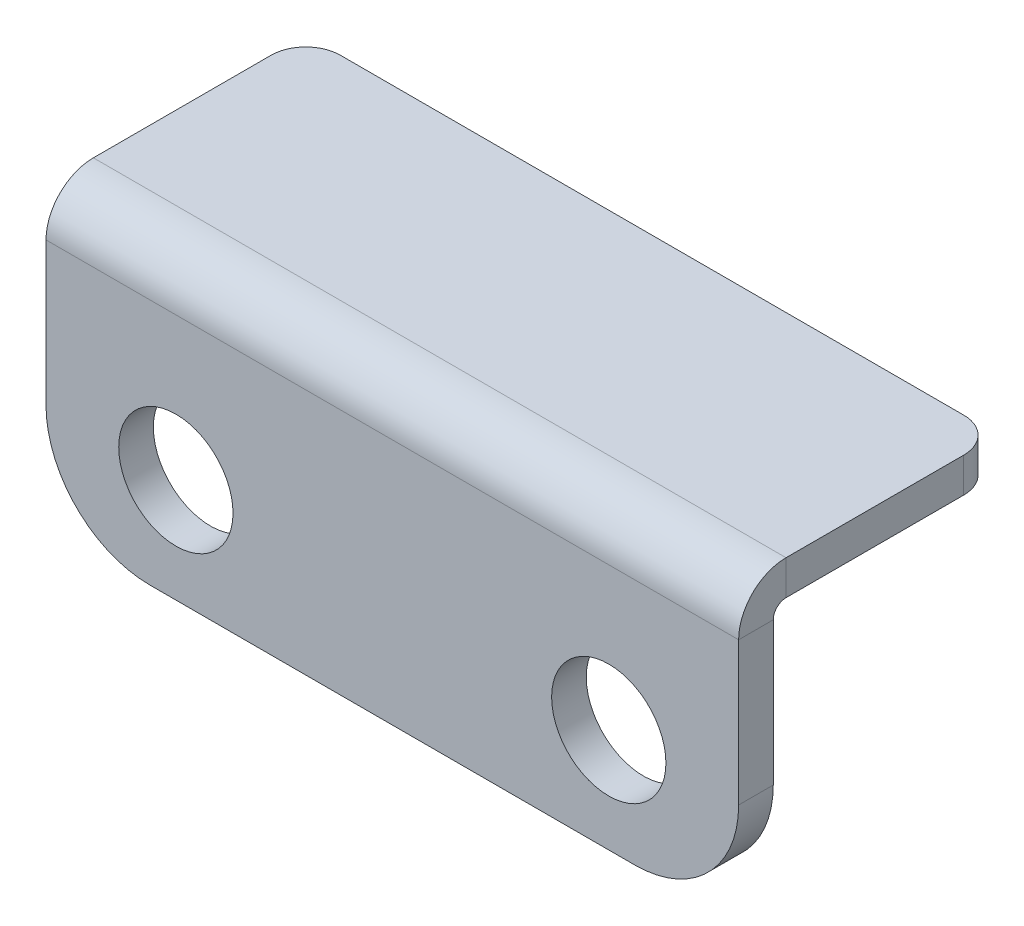
ISO-10303-21;
HEADER;
FILE_DESCRIPTION(('STEP AP214'),'2;1');
FILE_NAME('part.step','',(''),(''),'','','');
FILE_SCHEMA(('AUTOMOTIVE_DESIGN { 1 0 10303 214 1 1 1 1 }'));
ENDSEC;
DATA;
#1=APPLICATION_CONTEXT('core data for automotive mechanical design processes');
#2=APPLICATION_PROTOCOL_DEFINITION('international standard','automotive_design',2000,#1);
#3=PRODUCT_CONTEXT('',#1,'mechanical');
#4=PRODUCT('Part','Part','',(#3));
#5=PRODUCT_RELATED_PRODUCT_CATEGORY('part','',(#4));
#6=PRODUCT_DEFINITION_FORMATION('','',#4);
#7=PRODUCT_DEFINITION_CONTEXT('part definition',#1,'design');
#8=PRODUCT_DEFINITION('design','',#6,#7);
#9=PRODUCT_DEFINITION_SHAPE('','',#8);
#10=(LENGTH_UNIT() NAMED_UNIT(*) SI_UNIT(.MILLI.,.METRE.));
#11=(NAMED_UNIT(*) PLANE_ANGLE_UNIT() SI_UNIT($,.RADIAN.));
#12=(NAMED_UNIT(*) SI_UNIT($,.STERADIAN.) SOLID_ANGLE_UNIT());
#13=UNCERTAINTY_MEASURE_WITH_UNIT(LENGTH_MEASURE(1.E-05),#10,'distance_accuracy_value','');
#14=(GEOMETRIC_REPRESENTATION_CONTEXT(3) GLOBAL_UNCERTAINTY_ASSIGNED_CONTEXT((#13)) GLOBAL_UNIT_ASSIGNED_CONTEXT((#10,
#11,#12)) REPRESENTATION_CONTEXT('',''));
#15=CARTESIAN_POINT('',(0.,0.,0.));
#16=DIRECTION('',(0.,0.,1.));
#17=DIRECTION('',(1.,0.,0.));
#18=AXIS2_PLACEMENT_3D('',#15,#16,#17);
#19=CARTESIAN_POINT('',(20.,8.5,-2.));
#20=DIRECTION('',(1.,0.,0.));
#21=DIRECTION('',(0.,1.,0.));
#22=AXIS2_PLACEMENT_3D('',#19,#20,#21);
#23=PLANE('',#22);
#24=DIRECTION('',(0.,1.,0.));
#25=VECTOR('',#24,1.);
#26=CARTESIAN_POINT('',(20.,8.5,0.));
#27=LINE('',#26,#25);
#28=CARTESIAN_POINT('',(20.,-2.5,0.));
#29=VERTEX_POINT('',#28);
#30=CARTESIAN_POINT('',(20.,5.7634,0.));
#31=VERTEX_POINT('',#30);
#32=EDGE_CURVE('E208',#29,#31,#27,.T.);
#33=ORIENTED_EDGE('',*,*,#32,.F.);
#34=DIRECTION('',(0.,0.,1.));
#35=VECTOR('',#34,1.);
#36=CARTESIAN_POINT('',(20.,-2.5,-2.));
#37=LINE('',#36,#35);
#38=CARTESIAN_POINT('',(20.,-2.5,-2.));
#39=VERTEX_POINT('',#38);
#40=EDGE_CURVE('E248',#29,#39,#37,.F.);
#41=ORIENTED_EDGE('',*,*,#40,.T.);
#42=DIRECTION('',(0.,1.,0.));
#43=VECTOR('',#42,1.);
#44=CARTESIAN_POINT('',(20.,8.5,-2.));
#45=LINE('',#44,#43);
#46=CARTESIAN_POINT('',(20.,5.7634,-2.));
#47=VERTEX_POINT('',#46);
#48=EDGE_CURVE('E210',#39,#47,#45,.T.);
#49=ORIENTED_EDGE('',*,*,#48,.T.);
#50=DIRECTION('',(0.,0.,1.));
#51=VECTOR('',#50,1.);
#52=CARTESIAN_POINT('',(20.,5.7634,-2.));
#53=LINE('',#52,#51);
#54=EDGE_CURVE('E198',#47,#31,#53,.T.);
#55=ORIENTED_EDGE('',*,*,#54,.T.);
#56=EDGE_LOOP('',(#33,#41,#49,#55));
#57=FACE_BOUND('',#56,.T.);
#58=ADVANCED_FACE('F58',(#57),#23,.T.);
#59=CARTESIAN_POINT('',(0.,0.,-2.));
#60=DIRECTION('',(0.,0.,1.));
#61=DIRECTION('',(1.,0.,0.));
#62=AXIS2_PLACEMENT_3D('',#59,#60,#61);
#63=PLANE('',#62);
#64=CARTESIAN_POINT('',(-12.5,-2.5,-2.));
#65=DIRECTION('',(0.,0.,-1.));
#66=DIRECTION('',(-1.,0.,0.));
#67=AXIS2_PLACEMENT_3D('',#64,#65,#66);
#68=CIRCLE('',#67,3.3);
#69=CARTESIAN_POINT('',(-15.8,-2.5,-2.));
#70=VERTEX_POINT('',#69);
#71=EDGE_CURVE('E232',#70,#70,#68,.T.);
#72=ORIENTED_EDGE('',*,*,#71,.F.);
#73=EDGE_LOOP('',(#72));
#74=FACE_BOUND('',#73,.T.);
#75=CARTESIAN_POINT('',(12.5,-2.5,-2.));
#76=DIRECTION('',(0.,0.,-1.));
#77=DIRECTION('',(-1.,0.,0.));
#78=AXIS2_PLACEMENT_3D('',#75,#76,#77);
#79=CIRCLE('',#78,3.3);
#80=CARTESIAN_POINT('',(9.2,-2.5,-2.));
#81=VERTEX_POINT('',#80);
#82=EDGE_CURVE('E228',#81,#81,#79,.T.);
#83=ORIENTED_EDGE('',*,*,#82,.F.);
#84=EDGE_LOOP('',(#83));
#85=FACE_BOUND('',#84,.T.);
#86=DIRECTION('',(1.,0.,0.));
#87=VECTOR('',#86,1.);
#88=CARTESIAN_POINT('',(-20.,-8.5,-2.));
#89=LINE('',#88,#87);
#90=CARTESIAN_POINT('',(-14.,-8.5,-2.));
#91=VERTEX_POINT('',#90);
#92=CARTESIAN_POINT('',(14.,-8.5,-2.));
#93=VERTEX_POINT('',#92);
#94=EDGE_CURVE('E216',#91,#93,#89,.T.);
#95=ORIENTED_EDGE('',*,*,#94,.F.);
#96=CARTESIAN_POINT('',(-14.,-2.5,-2.));
#97=DIRECTION('',(0.,0.,1.));
#98=DIRECTION('',(1.,0.,0.));
#99=AXIS2_PLACEMENT_3D('',#96,#97,#98);
#100=CIRCLE('',#99,6.);
#101=CARTESIAN_POINT('',(-20.,-2.5,-2.));
#102=VERTEX_POINT('',#101);
#103=EDGE_CURVE('E246',#91,#102,#100,.F.);
#104=ORIENTED_EDGE('',*,*,#103,.T.);
#105=DIRECTION('',(0.,-1.,0.));
#106=VECTOR('',#105,1.);
#107=CARTESIAN_POINT('',(-20.,8.5,-2.));
#108=LINE('',#107,#106);
#109=CARTESIAN_POINT('',(-20.,5.7634,-2.));
#110=VERTEX_POINT('',#109);
#111=EDGE_CURVE('E212',#110,#102,#108,.T.);
#112=ORIENTED_EDGE('',*,*,#111,.F.);
#113=DIRECTION('',(1.,0.,0.));
#114=VECTOR('',#113,1.);
#115=CARTESIAN_POINT('',(20.,5.7634,-2.));
#116=LINE('',#115,#114);
#117=EDGE_CURVE('E202',#47,#110,#116,.F.);
#118=ORIENTED_EDGE('',*,*,#117,.F.);
#119=ORIENTED_EDGE('',*,*,#48,.F.);
#120=CARTESIAN_POINT('',(14.,-2.5,-2.));
#121=DIRECTION('',(0.,0.,1.));
#122=DIRECTION('',(1.,0.,0.));
#123=AXIS2_PLACEMENT_3D('',#120,#121,#122);
#124=CIRCLE('',#123,6.);
#125=EDGE_CURVE('E244',#39,#93,#124,.F.);
#126=ORIENTED_EDGE('',*,*,#125,.T.);
#127=EDGE_LOOP('',(#95,#104,#112,#118,#119,#126));
#128=FACE_BOUND('',#127,.T.);
#129=ADVANCED_FACE('F291',(#74,#85,#128),#63,.F.);
#130=CARTESIAN_POINT('',(0.,0.,0.));
#131=DIRECTION('',(0.,0.,1.));
#132=DIRECTION('',(1.,0.,0.));
#133=AXIS2_PLACEMENT_3D('',#130,#131,#132);
#134=PLANE('',#133);
#135=CARTESIAN_POINT('',(-12.5,-2.5,0.));
#136=DIRECTION('',(0.,0.,1.));
#137=DIRECTION('',(1.,0.,0.));
#138=AXIS2_PLACEMENT_3D('',#135,#136,#137);
#139=CIRCLE('',#138,3.3);
#140=CARTESIAN_POINT('',(-9.2,-2.5,0.));
#141=VERTEX_POINT('',#140);
#142=EDGE_CURVE('E229',#141,#141,#139,.T.);
#143=ORIENTED_EDGE('',*,*,#142,.F.);
#144=EDGE_LOOP('',(#143));
#145=FACE_BOUND('',#144,.T.);
#146=CARTESIAN_POINT('',(12.5,-2.5,0.));
#147=DIRECTION('',(0.,0.,1.));
#148=DIRECTION('',(1.,0.,0.));
#149=AXIS2_PLACEMENT_3D('',#146,#147,#148);
#150=CIRCLE('',#149,3.3);
#151=CARTESIAN_POINT('',(15.8,-2.5,0.));
#152=VERTEX_POINT('',#151);
#153=EDGE_CURVE('E195',#152,#152,#150,.T.);
#154=ORIENTED_EDGE('',*,*,#153,.F.);
#155=EDGE_LOOP('',(#154));
#156=FACE_BOUND('',#155,.T.);
#157=DIRECTION('',(0.,-1.,0.));
#158=VECTOR('',#157,1.);
#159=CARTESIAN_POINT('',(-20.,8.5,0.));
#160=LINE('',#159,#158);
#161=CARTESIAN_POINT('',(-20.,5.7634,0.));
#162=VERTEX_POINT('',#161);
#163=CARTESIAN_POINT('',(-20.,-2.5,0.));
#164=VERTEX_POINT('',#163);
#165=EDGE_CURVE('E221',#162,#164,#160,.T.);
#166=ORIENTED_EDGE('',*,*,#165,.T.);
#167=CARTESIAN_POINT('',(-14.,-2.5,0.));
#168=DIRECTION('',(0.,0.,1.));
#169=DIRECTION('',(1.,0.,0.));
#170=AXIS2_PLACEMENT_3D('',#167,#168,#169);
#171=CIRCLE('',#170,6.);
#172=CARTESIAN_POINT('',(-14.,-8.5,0.));
#173=VERTEX_POINT('',#172);
#174=EDGE_CURVE('E237',#164,#173,#171,.T.);
#175=ORIENTED_EDGE('',*,*,#174,.T.);
#176=DIRECTION('',(1.,0.,0.));
#177=VECTOR('',#176,1.);
#178=CARTESIAN_POINT('',(-20.,-8.5,0.));
#179=LINE('',#178,#177);
#180=CARTESIAN_POINT('',(14.,-8.5,0.));
#181=VERTEX_POINT('',#180);
#182=EDGE_CURVE('E213',#173,#181,#179,.T.);
#183=ORIENTED_EDGE('',*,*,#182,.T.);
#184=CARTESIAN_POINT('',(14.,-2.5,0.));
#185=DIRECTION('',(0.,0.,1.));
#186=DIRECTION('',(1.,0.,0.));
#187=AXIS2_PLACEMENT_3D('',#184,#185,#186);
#188=CIRCLE('',#187,6.);
#189=EDGE_CURVE('E235',#181,#29,#188,.T.);
#190=ORIENTED_EDGE('',*,*,#189,.T.);
#191=ORIENTED_EDGE('',*,*,#32,.T.);
#192=DIRECTION('',(1.,0.,0.));
#193=VECTOR('',#192,1.);
#194=CARTESIAN_POINT('',(20.,5.7634,0.));
#195=LINE('',#194,#193);
#196=EDGE_CURVE('E157',#31,#162,#195,.F.);
#197=ORIENTED_EDGE('',*,*,#196,.T.);
#198=EDGE_LOOP('',(#166,#175,#183,#190,#191,#197));
#199=FACE_BOUND('',#198,.T.);
#200=ADVANCED_FACE('F298',(#145,#156,#199),#134,.T.);
#201=CARTESIAN_POINT('',(-20.,-8.5,-2.));
#202=DIRECTION('',(0.,-1.,0.));
#203=DIRECTION('',(0.,0.,-1.));
#204=AXIS2_PLACEMENT_3D('',#201,#202,#203);
#205=PLANE('',#204);
#206=ORIENTED_EDGE('',*,*,#182,.F.);
#207=DIRECTION('',(0.,0.,1.));
#208=VECTOR('',#207,1.);
#209=CARTESIAN_POINT('',(-14.,-8.5,-2.));
#210=LINE('',#209,#208);
#211=EDGE_CURVE('E242',#173,#91,#210,.F.);
#212=ORIENTED_EDGE('',*,*,#211,.T.);
#213=ORIENTED_EDGE('',*,*,#94,.T.);
#214=DIRECTION('',(0.,0.,1.));
#215=VECTOR('',#214,1.);
#216=CARTESIAN_POINT('',(14.,-8.5,-2.));
#217=LINE('',#216,#215);
#218=EDGE_CURVE('E239',#93,#181,#217,.T.);
#219=ORIENTED_EDGE('',*,*,#218,.T.);
#220=EDGE_LOOP('',(#206,#212,#213,#219));
#221=FACE_BOUND('',#220,.T.);
#222=ADVANCED_FACE('F308',(#221),#205,.T.);
#223=CARTESIAN_POINT('',(-20.,8.5,-2.));
#224=DIRECTION('',(-1.,0.,0.));
#225=DIRECTION('',(0.,0.,1.));
#226=AXIS2_PLACEMENT_3D('',#223,#224,#225);
#227=PLANE('',#226);
#228=ORIENTED_EDGE('',*,*,#111,.T.);
#229=DIRECTION('',(0.,0.,1.));
#230=VECTOR('',#229,1.);
#231=CARTESIAN_POINT('',(-20.,-2.5,-2.));
#232=LINE('',#231,#230);
#233=EDGE_CURVE('E219',#102,#164,#232,.T.);
#234=ORIENTED_EDGE('',*,*,#233,.T.);
#235=ORIENTED_EDGE('',*,*,#165,.F.);
#236=DIRECTION('',(0.,0.,1.));
#237=VECTOR('',#236,1.);
#238=CARTESIAN_POINT('',(-20.,5.7634,-2.));
#239=LINE('',#238,#237);
#240=EDGE_CURVE('E205',#110,#162,#239,.T.);
#241=ORIENTED_EDGE('',*,*,#240,.F.);
#242=EDGE_LOOP('',(#228,#234,#235,#241));
#243=FACE_BOUND('',#242,.T.);
#244=ADVANCED_FACE('F287',(#243),#227,.T.);
#245=CARTESIAN_POINT('',(-20.,5.7634,-2.7366));
#246=DIRECTION('',(-1.,0.,0.));
#247=DIRECTION('',(0.,0.,1.));
#248=AXIS2_PLACEMENT_3D('',#245,#246,#247);
#249=PLANE('',#248);
#250=DIRECTION('',(0.,-1.,0.));
#251=VECTOR('',#250,1.);
#252=CARTESIAN_POINT('',(-20.,8.5,-2.73659999999999));
#253=LINE('',#252,#251);
#254=CARTESIAN_POINT('',(-20.,6.5,-2.7366));
#255=VERTEX_POINT('',#254);
#256=CARTESIAN_POINT('',(-20.,8.5,-2.73659999999999));
#257=VERTEX_POINT('',#256);
#258=EDGE_CURVE('E192',#255,#257,#253,.F.);
#259=ORIENTED_EDGE('',*,*,#258,.F.);
#260=CARTESIAN_POINT('',(-20.,5.7634,-2.7366));
#261=DIRECTION('',(1.,0.,0.));
#262=DIRECTION('',(0.,0.,-1.));
#263=AXIS2_PLACEMENT_3D('',#260,#261,#262);
#264=CIRCLE('',#263,0.7366);
#265=EDGE_CURVE('E161',#110,#255,#264,.F.);
#266=ORIENTED_EDGE('',*,*,#265,.F.);
#267=ORIENTED_EDGE('',*,*,#240,.T.);
#268=CARTESIAN_POINT('',(-20.,5.7634,-2.7366));
#269=DIRECTION('',(1.,0.,0.));
#270=DIRECTION('',(0.,0.,-1.));
#271=AXIS2_PLACEMENT_3D('',#268,#269,#270);
#272=CIRCLE('',#271,2.7366);
#273=EDGE_CURVE('E197',#162,#257,#272,.F.);
#274=ORIENTED_EDGE('',*,*,#273,.T.);
#275=EDGE_LOOP('',(#259,#266,#267,#274));
#276=FACE_BOUND('',#275,.T.);
#277=ADVANCED_FACE('F283',(#276),#249,.T.);
#278=CARTESIAN_POINT('',(20.,5.7634,-2.7366));
#279=DIRECTION('',(-1.,0.,0.));
#280=DIRECTION('',(0.,0.,1.));
#281=AXIS2_PLACEMENT_3D('',#278,#279,#280);
#282=PLANE('',#281);
#283=CARTESIAN_POINT('',(20.,5.7634,-2.7366));
#284=DIRECTION('',(1.,0.,0.));
#285=DIRECTION('',(0.,0.,-1.));
#286=AXIS2_PLACEMENT_3D('',#283,#284,#285);
#287=CIRCLE('',#286,0.7366);
#288=CARTESIAN_POINT('',(20.,6.5,-2.7366));
#289=VERTEX_POINT('',#288);
#290=EDGE_CURVE('E168',#289,#47,#287,.T.);
#291=ORIENTED_EDGE('',*,*,#290,.F.);
#292=DIRECTION('',(0.,-1.,0.));
#293=VECTOR('',#292,1.);
#294=CARTESIAN_POINT('',(20.,6.5,-2.7366));
#295=LINE('',#294,#293);
#296=CARTESIAN_POINT('',(20.,8.5,-2.73659999999999));
#297=VERTEX_POINT('',#296);
#298=EDGE_CURVE('E165',#289,#297,#295,.F.);
#299=ORIENTED_EDGE('',*,*,#298,.T.);
#300=CARTESIAN_POINT('',(20.,5.7634,-2.7366));
#301=DIRECTION('',(1.,0.,0.));
#302=DIRECTION('',(0.,0.,-1.));
#303=AXIS2_PLACEMENT_3D('',#300,#301,#302);
#304=CIRCLE('',#303,2.7366);
#305=EDGE_CURVE('E150',#297,#31,#304,.T.);
#306=ORIENTED_EDGE('',*,*,#305,.T.);
#307=ORIENTED_EDGE('',*,*,#54,.F.);
#308=EDGE_LOOP('',(#291,#299,#306,#307));
#309=FACE_BOUND('',#308,.T.);
#310=ADVANCED_FACE('F166',(#309),#282,.F.);
#311=CARTESIAN_POINT('',(20.,5.7634,-2.7366));
#312=DIRECTION('',(1.,0.,0.));
#313=DIRECTION('',(0.,1.,0.));
#314=AXIS2_PLACEMENT_3D('',#311,#312,#313);
#315=CYLINDRICAL_SURFACE('',#314,2.7366);
#316=ORIENTED_EDGE('',*,*,#196,.F.);
#317=ORIENTED_EDGE('',*,*,#305,.F.);
#318=DIRECTION('',(1.,0.,0.));
#319=VECTOR('',#318,1.);
#320=CARTESIAN_POINT('',(-20.,8.5,-2.73659999999999));
#321=LINE('',#320,#319);
#322=EDGE_CURVE('E154',#297,#257,#321,.F.);
#323=ORIENTED_EDGE('',*,*,#322,.T.);
#324=ORIENTED_EDGE('',*,*,#273,.F.);
#325=EDGE_LOOP('',(#316,#317,#323,#324));
#326=FACE_BOUND('',#325,.T.);
#327=ADVANCED_FACE('F152',(#326),#315,.T.);
#328=CARTESIAN_POINT('',(20.,5.7634,-2.7366));
#329=DIRECTION('',(1.,0.,0.));
#330=DIRECTION('',(0.,1.,0.));
#331=AXIS2_PLACEMENT_3D('',#328,#329,#330);
#332=CYLINDRICAL_SURFACE('',#331,0.7366);
#333=ORIENTED_EDGE('',*,*,#117,.T.);
#334=ORIENTED_EDGE('',*,*,#265,.T.);
#335=DIRECTION('',(1.,0.,0.));
#336=VECTOR('',#335,1.);
#337=CARTESIAN_POINT('',(-20.,6.5,-2.7366));
#338=LINE('',#337,#336);
#339=EDGE_CURVE('E170',#255,#289,#338,.T.);
#340=ORIENTED_EDGE('',*,*,#339,.T.);
#341=ORIENTED_EDGE('',*,*,#290,.T.);
#342=EDGE_LOOP('',(#333,#334,#340,#341));
#343=FACE_BOUND('',#342,.T.);
#344=ADVANCED_FACE('F278',(#343),#332,.F.);
#345=CARTESIAN_POINT('',(20.,8.50000000000004,-15.));
#346=DIRECTION('',(-1.,0.,0.));
#347=DIRECTION('',(0.,0.,1.));
#348=AXIS2_PLACEMENT_3D('',#345,#346,#347);
#349=PLANE('',#348);
#350=DIRECTION('',(0.,0.,1.));
#351=VECTOR('',#350,1.);
#352=CARTESIAN_POINT('',(20.,6.50000000000004,-15.));
#353=LINE('',#352,#351);
#354=CARTESIAN_POINT('',(20.,6.50000000000004,-13.));
#355=VERTEX_POINT('',#354);
#356=EDGE_CURVE('E178',#289,#355,#353,.F.);
#357=ORIENTED_EDGE('',*,*,#356,.T.);
#358=DIRECTION('',(0.,-1.,0.));
#359=VECTOR('',#358,1.);
#360=CARTESIAN_POINT('',(20.,8.50000000000004,-13.));
#361=LINE('',#360,#359);
#362=CARTESIAN_POINT('',(20.,8.50000000000004,-13.));
#363=VERTEX_POINT('',#362);
#364=EDGE_CURVE('E13',#355,#363,#361,.F.);
#365=ORIENTED_EDGE('',*,*,#364,.T.);
#366=DIRECTION('',(0.,0.,-1.));
#367=VECTOR('',#366,1.);
#368=CARTESIAN_POINT('',(20.,8.49999999999999,0.));
#369=LINE('',#368,#367);
#370=EDGE_CURVE('E174',#297,#363,#369,.T.);
#371=ORIENTED_EDGE('',*,*,#370,.F.);
#372=ORIENTED_EDGE('',*,*,#298,.F.);
#373=EDGE_LOOP('',(#357,#365,#371,#372));
#374=FACE_BOUND('',#373,.T.);
#375=ADVANCED_FACE('F180',(#374),#349,.F.);
#376=CARTESIAN_POINT('',(-20.,8.5,-1.99999999999999));
#377=DIRECTION('',(1.,0.,0.));
#378=DIRECTION('',(0.,0.,-1.));
#379=AXIS2_PLACEMENT_3D('',#376,#377,#378);
#380=PLANE('',#379);
#381=DIRECTION('',(0.,0.,1.));
#382=VECTOR('',#381,1.);
#383=CARTESIAN_POINT('',(-20.,8.49999999999999,0.));
#384=LINE('',#383,#382);
#385=CARTESIAN_POINT('',(-20.,8.50000000000004,-13.));
#386=VERTEX_POINT('',#385);
#387=EDGE_CURVE('E177',#386,#257,#384,.T.);
#388=ORIENTED_EDGE('',*,*,#387,.F.);
#389=DIRECTION('',(0.,-1.,0.));
#390=VECTOR('',#389,1.);
#391=CARTESIAN_POINT('',(-20.,8.50000000000004,-13.));
#392=LINE('',#391,#390);
#393=CARTESIAN_POINT('',(-20.,6.50000000000004,-13.));
#394=VERTEX_POINT('',#393);
#395=EDGE_CURVE('E250',#386,#394,#392,.T.);
#396=ORIENTED_EDGE('',*,*,#395,.T.);
#397=DIRECTION('',(0.,0.,-1.));
#398=VECTOR('',#397,1.);
#399=CARTESIAN_POINT('',(-20.,6.5,-2.));
#400=LINE('',#399,#398);
#401=EDGE_CURVE('E182',#394,#255,#400,.F.);
#402=ORIENTED_EDGE('',*,*,#401,.T.);
#403=ORIENTED_EDGE('',*,*,#258,.T.);
#404=EDGE_LOOP('',(#388,#396,#402,#403));
#405=FACE_BOUND('',#404,.T.);
#406=ADVANCED_FACE('F266',(#405),#380,.F.);
#407=CARTESIAN_POINT('',(0.,8.49999999999999,0.));
#408=DIRECTION('',(0.,-1.,0.));
#409=DIRECTION('',(0.,0.,-1.));
#410=AXIS2_PLACEMENT_3D('',#407,#408,#409);
#411=PLANE('',#410);
#412=DIRECTION('',(-1.,0.,0.));
#413=VECTOR('',#412,1.);
#414=CARTESIAN_POINT('',(0.,8.50000000000004,-15.));
#415=LINE('',#414,#413);
#416=CARTESIAN_POINT('',(18.,8.50000000000004,-15.));
#417=VERTEX_POINT('',#416);
#418=CARTESIAN_POINT('',(-18.,8.50000000000004,-15.));
#419=VERTEX_POINT('',#418);
#420=EDGE_CURVE('E181',#417,#419,#415,.T.);
#421=ORIENTED_EDGE('',*,*,#420,.T.);
#422=CARTESIAN_POINT('',(-18.,8.50000000000004,-13.));
#423=DIRECTION('',(0.,-1.,0.));
#424=DIRECTION('',(0.,0.,-1.));
#425=AXIS2_PLACEMENT_3D('',#422,#423,#424);
#426=CIRCLE('',#425,2.);
#427=EDGE_CURVE('E66',#419,#386,#426,.F.);
#428=ORIENTED_EDGE('',*,*,#427,.T.);
#429=ORIENTED_EDGE('',*,*,#387,.T.);
#430=ORIENTED_EDGE('',*,*,#322,.F.);
#431=ORIENTED_EDGE('',*,*,#370,.T.);
#432=CARTESIAN_POINT('',(18.,8.50000000000004,-13.));
#433=DIRECTION('',(0.,-1.,0.));
#434=DIRECTION('',(0.,0.,-1.));
#435=AXIS2_PLACEMENT_3D('',#432,#433,#434);
#436=CIRCLE('',#435,2.);
#437=EDGE_CURVE('E261',#363,#417,#436,.F.);
#438=ORIENTED_EDGE('',*,*,#437,.T.);
#439=EDGE_LOOP('',(#421,#428,#429,#430,#431,#438));
#440=FACE_BOUND('',#439,.T.);
#441=ADVANCED_FACE('F173',(#440),#411,.F.);
#442=CARTESIAN_POINT('',(0.,6.49999999999999,0.));
#443=DIRECTION('',(0.,-1.,0.));
#444=DIRECTION('',(0.,0.,-1.));
#445=AXIS2_PLACEMENT_3D('',#442,#443,#444);
#446=PLANE('',#445);
#447=ORIENTED_EDGE('',*,*,#401,.F.);
#448=CARTESIAN_POINT('',(-18.,6.50000000000004,-13.));
#449=DIRECTION('',(0.,-1.,0.));
#450=DIRECTION('',(0.,0.,-1.));
#451=AXIS2_PLACEMENT_3D('',#448,#449,#450);
#452=CIRCLE('',#451,2.);
#453=CARTESIAN_POINT('',(-18.,6.50000000000004,-15.));
#454=VERTEX_POINT('',#453);
#455=EDGE_CURVE('E255',#394,#454,#452,.T.);
#456=ORIENTED_EDGE('',*,*,#455,.T.);
#457=DIRECTION('',(1.,0.,0.));
#458=VECTOR('',#457,1.);
#459=CARTESIAN_POINT('',(-20.,6.50000000000004,-15.));
#460=LINE('',#459,#458);
#461=CARTESIAN_POINT('',(18.,6.50000000000004,-15.));
#462=VERTEX_POINT('',#461);
#463=EDGE_CURVE('E185',#462,#454,#460,.F.);
#464=ORIENTED_EDGE('',*,*,#463,.F.);
#465=CARTESIAN_POINT('',(18.,6.50000000000004,-13.));
#466=DIRECTION('',(0.,-1.,0.));
#467=DIRECTION('',(0.,0.,-1.));
#468=AXIS2_PLACEMENT_3D('',#465,#466,#467);
#469=CIRCLE('',#468,2.);
#470=EDGE_CURVE('E253',#462,#355,#469,.T.);
#471=ORIENTED_EDGE('',*,*,#470,.T.);
#472=ORIENTED_EDGE('',*,*,#356,.F.);
#473=ORIENTED_EDGE('',*,*,#339,.F.);
#474=EDGE_LOOP('',(#447,#456,#464,#471,#472,#473));
#475=FACE_BOUND('',#474,.T.);
#476=ADVANCED_FACE('F272',(#475),#446,.T.);
#477=CARTESIAN_POINT('',(-20.,8.50000000000004,-15.));
#478=DIRECTION('',(0.,0.,1.));
#479=DIRECTION('',(0.,-1.,0.));
#480=AXIS2_PLACEMENT_3D('',#477,#478,#479);
#481=PLANE('',#480);
#482=ORIENTED_EDGE('',*,*,#463,.T.);
#483=DIRECTION('',(0.,-1.,0.));
#484=VECTOR('',#483,1.);
#485=CARTESIAN_POINT('',(-18.,8.50000000000004,-15.));
#486=LINE('',#485,#484);
#487=EDGE_CURVE('E79',#454,#419,#486,.F.);
#488=ORIENTED_EDGE('',*,*,#487,.T.);
#489=ORIENTED_EDGE('',*,*,#420,.F.);
#490=DIRECTION('',(0.,-1.,0.));
#491=VECTOR('',#490,1.);
#492=CARTESIAN_POINT('',(18.,8.50000000000004,-15.));
#493=LINE('',#492,#491);
#494=EDGE_CURVE('E257',#417,#462,#493,.T.);
#495=ORIENTED_EDGE('',*,*,#494,.T.);
#496=EDGE_LOOP('',(#482,#488,#489,#495));
#497=FACE_BOUND('',#496,.T.);
#498=ADVANCED_FACE('F274',(#497),#481,.F.);
#499=CARTESIAN_POINT('',(12.5,-2.5,8.));
#500=DIRECTION('',(0.,0.,-1.));
#501=DIRECTION('',(-1.,0.,0.));
#502=AXIS2_PLACEMENT_3D('',#499,#500,#501);
#503=CYLINDRICAL_SURFACE('',#502,3.3);
#504=ORIENTED_EDGE('',*,*,#153,.T.);
#505=EDGE_LOOP('',(#504));
#506=FACE_BOUND('',#505,.T.);
#507=ORIENTED_EDGE('',*,*,#82,.T.);
#508=EDGE_LOOP('',(#507));
#509=FACE_BOUND('',#508,.T.);
#510=ADVANCED_FACE('F350',(#506,#509),#503,.F.);
#511=CARTESIAN_POINT('',(-12.5,-2.5,8.));
#512=DIRECTION('',(0.,0.,-1.));
#513=DIRECTION('',(-1.,0.,0.));
#514=AXIS2_PLACEMENT_3D('',#511,#512,#513);
#515=CYLINDRICAL_SURFACE('',#514,3.3);
#516=ORIENTED_EDGE('',*,*,#142,.T.);
#517=EDGE_LOOP('',(#516));
#518=FACE_BOUND('',#517,.T.);
#519=ORIENTED_EDGE('',*,*,#71,.T.);
#520=EDGE_LOOP('',(#519));
#521=FACE_BOUND('',#520,.T.);
#522=ADVANCED_FACE('F328',(#518,#521),#515,.F.);
#523=CARTESIAN_POINT('',(-14.,-2.5,-2.));
#524=DIRECTION('',(0.,0.,1.));
#525=DIRECTION('',(1.,0.,0.));
#526=AXIS2_PLACEMENT_3D('',#523,#524,#525);
#527=CYLINDRICAL_SURFACE('',#526,6.);
#528=ORIENTED_EDGE('',*,*,#103,.F.);
#529=ORIENTED_EDGE('',*,*,#211,.F.);
#530=ORIENTED_EDGE('',*,*,#174,.F.);
#531=ORIENTED_EDGE('',*,*,#233,.F.);
#532=EDGE_LOOP('',(#528,#529,#530,#531));
#533=FACE_BOUND('',#532,.T.);
#534=ADVANCED_FACE('F296',(#533),#527,.T.);
#535=CARTESIAN_POINT('',(14.,-2.5,-2.));
#536=DIRECTION('',(0.,0.,1.));
#537=DIRECTION('',(1.,0.,0.));
#538=AXIS2_PLACEMENT_3D('',#535,#536,#537);
#539=CYLINDRICAL_SURFACE('',#538,6.);
#540=ORIENTED_EDGE('',*,*,#125,.F.);
#541=ORIENTED_EDGE('',*,*,#40,.F.);
#542=ORIENTED_EDGE('',*,*,#189,.F.);
#543=ORIENTED_EDGE('',*,*,#218,.F.);
#544=EDGE_LOOP('',(#540,#541,#542,#543));
#545=FACE_BOUND('',#544,.T.);
#546=ADVANCED_FACE('F305',(#545),#539,.T.);
#547=CARTESIAN_POINT('',(-18.,8.50000000000004,-13.));
#548=DIRECTION('',(0.,-1.,0.));
#549=DIRECTION('',(0.,0.,-1.));
#550=AXIS2_PLACEMENT_3D('',#547,#548,#549);
#551=CYLINDRICAL_SURFACE('',#550,2.);
#552=ORIENTED_EDGE('',*,*,#427,.F.);
#553=ORIENTED_EDGE('',*,*,#487,.F.);
#554=ORIENTED_EDGE('',*,*,#455,.F.);
#555=ORIENTED_EDGE('',*,*,#395,.F.);
#556=EDGE_LOOP('',(#552,#553,#554,#555));
#557=FACE_BOUND('',#556,.T.);
#558=ADVANCED_FACE('F269',(#557),#551,.T.);
#559=CARTESIAN_POINT('',(18.,8.50000000000004,-13.));
#560=DIRECTION('',(0.,-1.,0.));
#561=DIRECTION('',(0.,0.,-1.));
#562=AXIS2_PLACEMENT_3D('',#559,#560,#561);
#563=CYLINDRICAL_SURFACE('',#562,2.);
#564=ORIENTED_EDGE('',*,*,#437,.F.);
#565=ORIENTED_EDGE('',*,*,#364,.F.);
#566=ORIENTED_EDGE('',*,*,#470,.F.);
#567=ORIENTED_EDGE('',*,*,#494,.F.);
#568=EDGE_LOOP('',(#564,#565,#566,#567));
#569=FACE_BOUND('',#568,.T.);
#570=ADVANCED_FACE('F60',(#569),#563,.T.);
#571=CLOSED_SHELL('',(#58,#129,#200,#222,#244,#277,#310,#327,#344,#375,#406,#441,#476,#498,#510,
#522,#534,#546,#558,#570));
#572=MANIFOLD_SOLID_BREP('B2',#571);
#573=ADVANCED_BREP_SHAPE_REPRESENTATION('',(#18,#572),#14);
#574=SHAPE_DEFINITION_REPRESENTATION(#9,#573);
ENDSEC;
END-ISO-10303-21;
